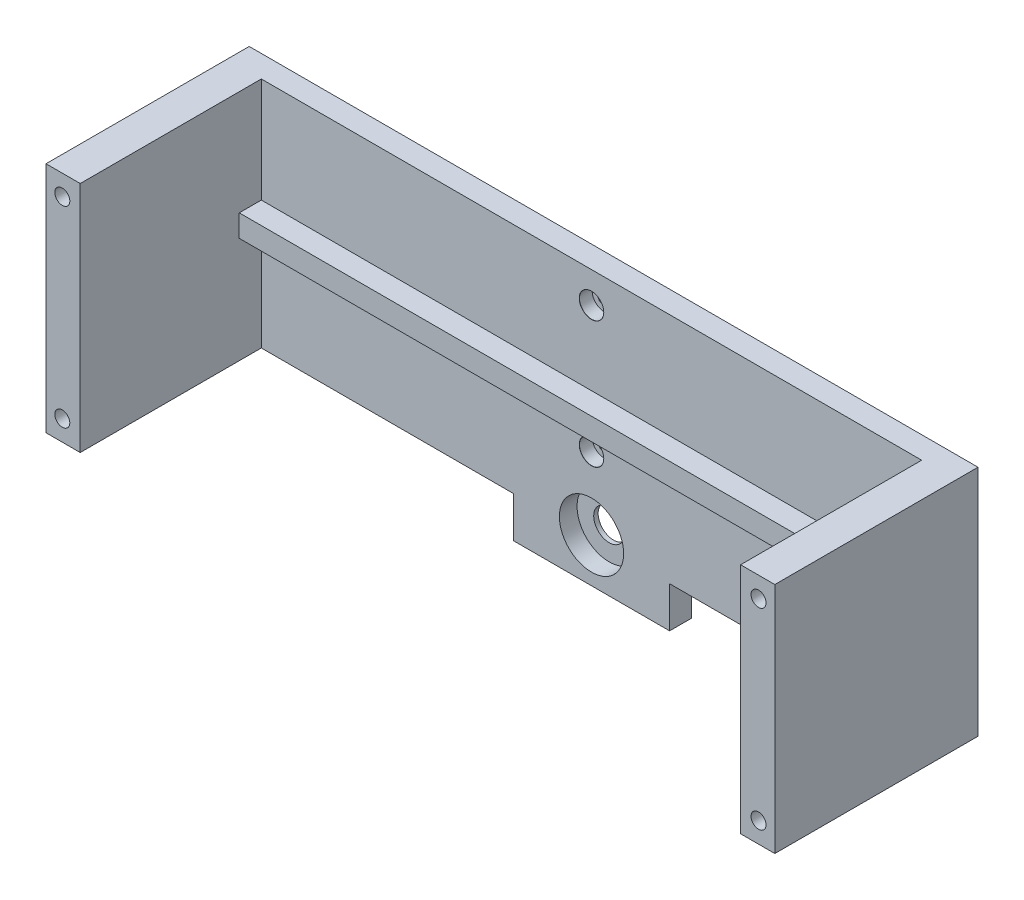
ISO-10303-21;
HEADER;
FILE_DESCRIPTION(('STEP AP214'),'2;1');
FILE_NAME('part.step','',(''),(''),'','','');
FILE_SCHEMA(('AUTOMOTIVE_DESIGN { 1 0 10303 214 1 1 1 1 }'));
ENDSEC;
DATA;
#1=APPLICATION_CONTEXT('core data for automotive mechanical design processes');
#2=APPLICATION_PROTOCOL_DEFINITION('international standard','automotive_design',2000,#1);
#3=PRODUCT_CONTEXT('',#1,'mechanical');
#4=PRODUCT('Part','Part','',(#3));
#5=PRODUCT_RELATED_PRODUCT_CATEGORY('part','',(#4));
#6=PRODUCT_DEFINITION_FORMATION('','',#4);
#7=PRODUCT_DEFINITION_CONTEXT('part definition',#1,'design');
#8=PRODUCT_DEFINITION('design','',#6,#7);
#9=PRODUCT_DEFINITION_SHAPE('','',#8);
#10=(LENGTH_UNIT() NAMED_UNIT(*) SI_UNIT(.MILLI.,.METRE.));
#11=(NAMED_UNIT(*) PLANE_ANGLE_UNIT() SI_UNIT($,.RADIAN.));
#12=(NAMED_UNIT(*) SI_UNIT($,.STERADIAN.) SOLID_ANGLE_UNIT());
#13=UNCERTAINTY_MEASURE_WITH_UNIT(LENGTH_MEASURE(1.E-05),#10,'distance_accuracy_value','');
#14=(GEOMETRIC_REPRESENTATION_CONTEXT(3) GLOBAL_UNCERTAINTY_ASSIGNED_CONTEXT((#13)) GLOBAL_UNIT_ASSIGNED_CONTEXT((#10,
#11,#12)) REPRESENTATION_CONTEXT('',''));
#15=CARTESIAN_POINT('',(0.,0.,0.));
#16=DIRECTION('',(0.,0.,1.));
#17=DIRECTION('',(1.,0.,0.));
#18=AXIS2_PLACEMENT_3D('',#15,#16,#17);
#19=CARTESIAN_POINT('',(-30.9078306890508,-31.9758108108108,5.));
#20=DIRECTION('',(0.,1.,0.));
#21=DIRECTION('',(0.,0.,1.));
#22=AXIS2_PLACEMENT_3D('',#19,#20,#21);
#23=PLANE('',#22);
#24=DIRECTION('',(0.,0.,1.));
#25=VECTOR('',#24,1.);
#26=CARTESIAN_POINT('',(69.2721693109492,-31.9758108108108,5.));
#27=LINE('',#26,#25);
#28=CARTESIAN_POINT('',(69.2721693109492,-31.9758108108108,0.));
#29=VERTEX_POINT('',#28);
#30=CARTESIAN_POINT('',(69.2721693109492,-31.9758108108108,5.));
#31=VERTEX_POINT('',#30);
#32=EDGE_CURVE('E189',#29,#31,#27,.T.);
#33=ORIENTED_EDGE('',*,*,#32,.F.);
#34=DIRECTION('',(1.,0.,0.));
#35=VECTOR('',#34,1.);
#36=CARTESIAN_POINT('',(-30.9078306890508,-31.9758108108108,0.));
#37=LINE('',#36,#35);
#38=CARTESIAN_POINT('',(134.092169310949,-31.9758108108108,0.));
#39=VERTEX_POINT('',#38);
#40=EDGE_CURVE('E325',#29,#39,#37,.T.);
#41=ORIENTED_EDGE('',*,*,#40,.T.);
#42=DIRECTION('',(0.,0.,-1.));
#43=VECTOR('',#42,1.);
#44=CARTESIAN_POINT('',(134.092169310949,-31.9758108108108,5.));
#45=LINE('',#44,#43);
#46=CARTESIAN_POINT('',(134.092169310949,-31.9758108108108,46.));
#47=VERTEX_POINT('',#46);
#48=EDGE_CURVE('E49',#47,#39,#45,.T.);
#49=ORIENTED_EDGE('',*,*,#48,.F.);
#50=DIRECTION('',(1.,0.,0.));
#51=VECTOR('',#50,1.);
#52=CARTESIAN_POINT('',(134.092169310949,-31.9758108108108,46.));
#53=LINE('',#52,#51);
#54=CARTESIAN_POINT('',(126.342169310949,-31.9758108108108,46.));
#55=VERTEX_POINT('',#54);
#56=EDGE_CURVE('E270',#55,#47,#53,.T.);
#57=ORIENTED_EDGE('',*,*,#56,.F.);
#58=DIRECTION('',(0.,0.,-1.));
#59=VECTOR('',#58,1.);
#60=CARTESIAN_POINT('',(126.342169310949,-31.9758108108108,46.));
#61=LINE('',#60,#59);
#62=CARTESIAN_POINT('',(126.342169310949,-31.9758108108108,5.));
#63=VERTEX_POINT('',#62);
#64=EDGE_CURVE('E308',#55,#63,#61,.T.);
#65=ORIENTED_EDGE('',*,*,#64,.T.);
#66=DIRECTION('',(1.,0.,0.));
#67=VECTOR('',#66,1.);
#68=CARTESIAN_POINT('',(-30.9078306890508,-31.9758108108108,5.));
#69=LINE('',#68,#67);
#70=EDGE_CURVE('E56',#31,#63,#69,.T.);
#71=ORIENTED_EDGE('',*,*,#70,.F.);
#72=EDGE_LOOP('',(#33,#41,#49,#57,#65,#71));
#73=FACE_BOUND('',#72,.T.);
#74=ADVANCED_FACE('F41',(#73),#23,.F.);
#75=DIRECTION('',(0.,0.,-1.));
#76=VECTOR('',#75,1.);
#77=CARTESIAN_POINT('',(33.9121693109492,-31.9758108108108,5.));
#78=LINE('',#77,#76);
#79=CARTESIAN_POINT('',(33.9121693109492,-31.9758108108108,5.));
#80=VERTEX_POINT('',#79);
#81=CARTESIAN_POINT('',(33.9121693109492,-31.9758108108108,0.));
#82=VERTEX_POINT('',#81);
#83=EDGE_CURVE('E64',#80,#82,#78,.T.);
#84=ORIENTED_EDGE('',*,*,#83,.F.);
#85=CARTESIAN_POINT('',(-23.1578306890508,-31.9758108108108,5.));
#86=VERTEX_POINT('',#85);
#87=EDGE_CURVE('E318',#86,#80,#69,.T.);
#88=ORIENTED_EDGE('',*,*,#87,.F.);
#89=DIRECTION('',(0.,0.,-1.));
#90=VECTOR('',#89,1.);
#91=CARTESIAN_POINT('',(-23.1578306890508,-31.9758108108108,46.));
#92=LINE('',#91,#90);
#93=CARTESIAN_POINT('',(-23.1578306890508,-31.9758108108108,46.));
#94=VERTEX_POINT('',#93);
#95=EDGE_CURVE('E314',#94,#86,#92,.T.);
#96=ORIENTED_EDGE('',*,*,#95,.F.);
#97=DIRECTION('',(1.,0.,0.));
#98=VECTOR('',#97,1.);
#99=CARTESIAN_POINT('',(-30.9078306890508,-31.9758108108108,46.));
#100=LINE('',#99,#98);
#101=CARTESIAN_POINT('',(-30.9078306890508,-31.9758108108108,46.));
#102=VERTEX_POINT('',#101);
#103=EDGE_CURVE('E263',#102,#94,#100,.T.);
#104=ORIENTED_EDGE('',*,*,#103,.F.);
#105=DIRECTION('',(0.,0.,-1.));
#106=VECTOR('',#105,1.);
#107=CARTESIAN_POINT('',(-30.9078306890508,-31.9758108108108,5.));
#108=LINE('',#107,#106);
#109=CARTESIAN_POINT('',(-30.9078306890508,-31.9758108108108,0.));
#110=VERTEX_POINT('',#109);
#111=EDGE_CURVE('E11',#102,#110,#108,.T.);
#112=ORIENTED_EDGE('',*,*,#111,.T.);
#113=EDGE_CURVE('E326',#110,#82,#37,.T.);
#114=ORIENTED_EDGE('',*,*,#113,.T.);
#115=EDGE_LOOP('',(#84,#88,#96,#104,#112,#114));
#116=FACE_BOUND('',#115,.T.);
#117=ADVANCED_FACE('F383',(#116),#23,.F.);
#118=CARTESIAN_POINT('',(-23.1578306890508,-7.97581081081081,46.));
#119=DIRECTION('',(0.,1.,0.));
#120=DIRECTION('',(0.,0.,1.));
#121=AXIS2_PLACEMENT_3D('',#118,#119,#120);
#122=PLANE('',#121);
#123=DIRECTION('',(1.,0.,0.));
#124=VECTOR('',#123,1.);
#125=CARTESIAN_POINT('',(-23.1578306890508,-7.97581081081081,9.99999999999998));
#126=LINE('',#125,#124);
#127=CARTESIAN_POINT('',(-23.1578306890508,-7.97581081081081,9.99999999999998));
#128=VERTEX_POINT('',#127);
#129=CARTESIAN_POINT('',(126.342169310949,-7.97581081081081,9.99999999999998));
#130=VERTEX_POINT('',#129);
#131=EDGE_CURVE('E251',#128,#130,#126,.T.);
#132=ORIENTED_EDGE('',*,*,#131,.F.);
#133=DIRECTION('',(0.,0.,-1.));
#134=VECTOR('',#133,1.);
#135=CARTESIAN_POINT('',(-23.1578306890508,-7.97581081081081,46.));
#136=LINE('',#135,#134);
#137=CARTESIAN_POINT('',(-23.1578306890508,-7.97581081081081,5.));
#138=VERTEX_POINT('',#137);
#139=EDGE_CURVE('E312',#128,#138,#136,.T.);
#140=ORIENTED_EDGE('',*,*,#139,.T.);
#141=DIRECTION('',(1.,0.,0.));
#142=VECTOR('',#141,1.);
#143=CARTESIAN_POINT('',(-23.1578306890508,-7.97581081081081,5.));
#144=LINE('',#143,#142);
#145=CARTESIAN_POINT('',(126.342169310949,-7.97581081081081,5.));
#146=VERTEX_POINT('',#145);
#147=EDGE_CURVE('E285',#138,#146,#144,.T.);
#148=ORIENTED_EDGE('',*,*,#147,.T.);
#149=DIRECTION('',(0.,0.,-1.));
#150=VECTOR('',#149,1.);
#151=CARTESIAN_POINT('',(126.342169310949,-7.97581081081081,46.));
#152=LINE('',#151,#150);
#153=EDGE_CURVE('E310',#130,#146,#152,.T.);
#154=ORIENTED_EDGE('',*,*,#153,.F.);
#155=EDGE_LOOP('',(#132,#140,#148,#154));
#156=FACE_BOUND('',#155,.T.);
#157=ADVANCED_FACE('F381',(#156),#122,.F.);
#158=CARTESIAN_POINT('',(-23.1578306890508,-2.97581081081081,46.));
#159=DIRECTION('',(0.,-1.,0.));
#160=DIRECTION('',(0.,0.,-1.));
#161=AXIS2_PLACEMENT_3D('',#158,#159,#160);
#162=PLANE('',#161);
#163=DIRECTION('',(-1.,0.,0.));
#164=VECTOR('',#163,1.);
#165=CARTESIAN_POINT('',(-23.1578306890508,-2.97581081081081,9.99999999999998));
#166=LINE('',#165,#164);
#167=CARTESIAN_POINT('',(126.342169310949,-2.97581081081081,9.99999999999998));
#168=VERTEX_POINT('',#167);
#169=CARTESIAN_POINT('',(-23.1578306890508,-2.97581081081081,9.99999999999998));
#170=VERTEX_POINT('',#169);
#171=EDGE_CURVE('E256',#168,#170,#166,.T.);
#172=ORIENTED_EDGE('',*,*,#171,.F.);
#173=DIRECTION('',(0.,0.,-1.));
#174=VECTOR('',#173,1.);
#175=CARTESIAN_POINT('',(126.342169310949,-2.97581081081081,46.));
#176=LINE('',#175,#174);
#177=CARTESIAN_POINT('',(126.342169310949,-2.97581081081081,5.));
#178=VERTEX_POINT('',#177);
#179=EDGE_CURVE('E303',#168,#178,#176,.T.);
#180=ORIENTED_EDGE('',*,*,#179,.T.);
#181=DIRECTION('',(-1.,0.,0.));
#182=VECTOR('',#181,1.);
#183=CARTESIAN_POINT('',(-23.1578306890508,-2.97581081081081,5.));
#184=LINE('',#183,#182);
#185=CARTESIAN_POINT('',(-23.1578306890508,-2.97581081081081,5.));
#186=VERTEX_POINT('',#185);
#187=EDGE_CURVE('E294',#178,#186,#184,.T.);
#188=ORIENTED_EDGE('',*,*,#187,.T.);
#189=DIRECTION('',(0.,0.,-1.));
#190=VECTOR('',#189,1.);
#191=CARTESIAN_POINT('',(-23.1578306890508,-2.97581081081081,46.));
#192=LINE('',#191,#190);
#193=EDGE_CURVE('E301',#170,#186,#192,.T.);
#194=ORIENTED_EDGE('',*,*,#193,.F.);
#195=EDGE_LOOP('',(#172,#180,#188,#194));
#196=FACE_BOUND('',#195,.T.);
#197=ADVANCED_FACE('F370',(#196),#162,.F.);
#198=CARTESIAN_POINT('',(0.,0.,46.));
#199=DIRECTION('',(0.,0.,1.));
#200=DIRECTION('',(1.,0.,0.));
#201=AXIS2_PLACEMENT_3D('',#198,#199,#200);
#202=PLANE('',#201);
#203=CARTESIAN_POINT('',(-27.2209329288818,16.1491891891892,46.));
#204=DIRECTION('',(0.,0.,1.));
#205=DIRECTION('',(1.,0.,0.));
#206=AXIS2_PLACEMENT_3D('',#203,#204,#205);
#207=CIRCLE('',#206,1.69999999999999);
#208=CARTESIAN_POINT('',(-25.5209329288818,16.1491891891892,46.));
#209=VERTEX_POINT('',#208);
#210=EDGE_CURVE('E225',#209,#209,#207,.T.);
#211=ORIENTED_EDGE('',*,*,#210,.F.);
#212=EDGE_LOOP('',(#211));
#213=FACE_BOUND('',#212,.T.);
#214=CARTESIAN_POINT('',(-27.2209329288818,-27.3508108108108,46.));
#215=DIRECTION('',(0.,0.,1.));
#216=DIRECTION('',(1.,0.,0.));
#217=AXIS2_PLACEMENT_3D('',#214,#215,#216);
#218=CIRCLE('',#217,1.69999999999999);
#219=CARTESIAN_POINT('',(-25.5209329288818,-27.3508108108108,46.));
#220=VERTEX_POINT('',#219);
#221=EDGE_CURVE('E243',#220,#220,#218,.T.);
#222=ORIENTED_EDGE('',*,*,#221,.F.);
#223=EDGE_LOOP('',(#222));
#224=FACE_BOUND('',#223,.T.);
#225=DIRECTION('',(0.,1.,0.));
#226=VECTOR('',#225,1.);
#227=CARTESIAN_POINT('',(-23.1578306890508,-7.97581081081081,46.));
#228=LINE('',#227,#226);
#229=CARTESIAN_POINT('',(-23.1578306890508,20.7741891891892,46.));
#230=VERTEX_POINT('',#229);
#231=EDGE_CURVE('E266',#94,#230,#228,.T.);
#232=ORIENTED_EDGE('',*,*,#231,.T.);
#233=DIRECTION('',(-1.,0.,0.));
#234=VECTOR('',#233,1.);
#235=CARTESIAN_POINT('',(-30.9078306890508,20.7741891891892,46.));
#236=LINE('',#235,#234);
#237=CARTESIAN_POINT('',(-30.9078306890508,20.7741891891892,46.));
#238=VERTEX_POINT('',#237);
#239=EDGE_CURVE('E279',#230,#238,#236,.T.);
#240=ORIENTED_EDGE('',*,*,#239,.T.);
#241=DIRECTION('',(0.,-1.,0.));
#242=VECTOR('',#241,1.);
#243=CARTESIAN_POINT('',(-30.9078306890508,20.7741891891892,46.));
#244=LINE('',#243,#242);
#245=EDGE_CURVE('E260',#238,#102,#244,.T.);
#246=ORIENTED_EDGE('',*,*,#245,.T.);
#247=ORIENTED_EDGE('',*,*,#103,.T.);
#248=EDGE_LOOP('',(#232,#240,#246,#247));
#249=FACE_BOUND('',#248,.T.);
#250=ADVANCED_FACE('F355',(#213,#224,#249),#202,.T.);
#251=CARTESIAN_POINT('',(0.,0.,5.));
#252=DIRECTION('',(0.,0.,1.));
#253=DIRECTION('',(1.,0.,0.));
#254=AXIS2_PLACEMENT_3D('',#251,#252,#253);
#255=PLANE('',#254);
#256=CARTESIAN_POINT('',(51.5921693109492,13.7741891891892,5.));
#257=DIRECTION('',(0.,0.,1.));
#258=DIRECTION('',(1.,0.,0.));
#259=AXIS2_PLACEMENT_3D('',#256,#257,#258);
#260=CIRCLE('',#259,2.775);
#261=CARTESIAN_POINT('',(54.3671693109492,13.7741891891892,5.));
#262=VERTEX_POINT('',#261);
#263=EDGE_CURVE('E190',#262,#262,#260,.T.);
#264=ORIENTED_EDGE('',*,*,#263,.F.);
#265=EDGE_LOOP('',(#264));
#266=FACE_BOUND('',#265,.T.);
#267=DIRECTION('',(0.,1.,0.));
#268=VECTOR('',#267,1.);
#269=CARTESIAN_POINT('',(-23.1578306890508,20.7741891891892,5.));
#270=LINE('',#269,#268);
#271=CARTESIAN_POINT('',(-23.1578306890508,20.7741891891892,5.));
#272=VERTEX_POINT('',#271);
#273=EDGE_CURVE('E264',#186,#272,#270,.T.);
#274=ORIENTED_EDGE('',*,*,#273,.F.);
#275=ORIENTED_EDGE('',*,*,#187,.F.);
#276=DIRECTION('',(0.,-1.,0.));
#277=VECTOR('',#276,1.);
#278=CARTESIAN_POINT('',(126.342169310949,20.7741891891892,5.));
#279=LINE('',#278,#277);
#280=CARTESIAN_POINT('',(126.342169310949,20.7741891891892,5.));
#281=VERTEX_POINT('',#280);
#282=EDGE_CURVE('E291',#281,#178,#279,.T.);
#283=ORIENTED_EDGE('',*,*,#282,.F.);
#284=DIRECTION('',(-1.,0.,0.));
#285=VECTOR('',#284,1.);
#286=CARTESIAN_POINT('',(-30.9078306890508,20.7741891891892,5.));
#287=LINE('',#286,#285);
#288=EDGE_CURVE('E320',#281,#272,#287,.T.);
#289=ORIENTED_EDGE('',*,*,#288,.T.);
#290=EDGE_LOOP('',(#274,#275,#283,#289));
#291=FACE_BOUND('',#290,.T.);
#292=ADVANCED_FACE('F367',(#266,#291),#255,.T.);
#293=CARTESIAN_POINT('',(-30.9078306890508,20.7741891891892,5.));
#294=DIRECTION('',(1.,0.,0.));
#295=DIRECTION('',(0.,1.,0.));
#296=AXIS2_PLACEMENT_3D('',#293,#294,#295);
#297=PLANE('',#296);
#298=DIRECTION('',(0.,-1.,0.));
#299=VECTOR('',#298,1.);
#300=CARTESIAN_POINT('',(-30.9078306890508,20.7741891891892,0.));
#301=LINE('',#300,#299);
#302=CARTESIAN_POINT('',(-30.9078306890508,20.7741891891892,0.));
#303=VERTEX_POINT('',#302);
#304=EDGE_CURVE('E317',#303,#110,#301,.T.);
#305=ORIENTED_EDGE('',*,*,#304,.T.);
#306=ORIENTED_EDGE('',*,*,#111,.F.);
#307=ORIENTED_EDGE('',*,*,#245,.F.);
#308=DIRECTION('',(0.,0.,-1.));
#309=VECTOR('',#308,1.);
#310=CARTESIAN_POINT('',(-30.9078306890508,20.7741891891892,5.));
#311=LINE('',#310,#309);
#312=EDGE_CURVE('E322',#238,#303,#311,.T.);
#313=ORIENTED_EDGE('',*,*,#312,.T.);
#314=EDGE_LOOP('',(#305,#306,#307,#313));
#315=FACE_BOUND('',#314,.T.);
#316=ADVANCED_FACE('F43',(#315),#297,.F.);
#317=CARTESIAN_POINT('',(134.092169310949,20.7741891891892,5.));
#318=DIRECTION('',(-1.,0.,0.));
#319=DIRECTION('',(0.,0.,1.));
#320=AXIS2_PLACEMENT_3D('',#317,#318,#319);
#321=PLANE('',#320);
#322=DIRECTION('',(0.,1.,0.));
#323=VECTOR('',#322,1.);
#324=CARTESIAN_POINT('',(134.092169310949,20.7741891891892,0.));
#325=LINE('',#324,#323);
#326=CARTESIAN_POINT('',(134.092169310949,20.7741891891892,0.));
#327=VERTEX_POINT('',#326);
#328=EDGE_CURVE('E328',#39,#327,#325,.T.);
#329=ORIENTED_EDGE('',*,*,#328,.T.);
#330=DIRECTION('',(0.,0.,-1.));
#331=VECTOR('',#330,1.);
#332=CARTESIAN_POINT('',(134.092169310949,20.7741891891892,5.));
#333=LINE('',#332,#331);
#334=CARTESIAN_POINT('',(134.092169310949,20.7741891891892,46.));
#335=VERTEX_POINT('',#334);
#336=EDGE_CURVE('E334',#335,#327,#333,.T.);
#337=ORIENTED_EDGE('',*,*,#336,.F.);
#338=DIRECTION('',(0.,1.,0.));
#339=VECTOR('',#338,1.);
#340=CARTESIAN_POINT('',(134.092169310949,20.7741891891892,46.));
#341=LINE('',#340,#339);
#342=EDGE_CURVE('E273',#47,#335,#341,.T.);
#343=ORIENTED_EDGE('',*,*,#342,.F.);
#344=ORIENTED_EDGE('',*,*,#48,.T.);
#345=EDGE_LOOP('',(#329,#337,#343,#344));
#346=FACE_BOUND('',#345,.T.);
#347=ADVANCED_FACE('F340',(#346),#321,.F.);
#348=CARTESIAN_POINT('',(-30.9078306890508,20.7741891891892,5.));
#349=DIRECTION('',(0.,-1.,0.));
#350=DIRECTION('',(0.,0.,-1.));
#351=AXIS2_PLACEMENT_3D('',#348,#349,#350);
#352=PLANE('',#351);
#353=DIRECTION('',(-1.,0.,0.));
#354=VECTOR('',#353,1.);
#355=CARTESIAN_POINT('',(-30.9078306890508,20.7741891891892,0.));
#356=LINE('',#355,#354);
#357=EDGE_CURVE('E330',#327,#303,#356,.T.);
#358=ORIENTED_EDGE('',*,*,#357,.T.);
#359=ORIENTED_EDGE('',*,*,#312,.F.);
#360=ORIENTED_EDGE('',*,*,#239,.F.);
#361=DIRECTION('',(0.,0.,-1.));
#362=VECTOR('',#361,1.);
#363=CARTESIAN_POINT('',(-23.1578306890508,20.7741891891892,46.));
#364=LINE('',#363,#362);
#365=EDGE_CURVE('E282',#230,#272,#364,.T.);
#366=ORIENTED_EDGE('',*,*,#365,.T.);
#367=ORIENTED_EDGE('',*,*,#288,.F.);
#368=DIRECTION('',(0.,0.,-1.));
#369=VECTOR('',#368,1.);
#370=CARTESIAN_POINT('',(126.342169310949,20.7741891891892,46.));
#371=LINE('',#370,#369);
#372=CARTESIAN_POINT('',(126.342169310949,20.7741891891892,46.));
#373=VERTEX_POINT('',#372);
#374=EDGE_CURVE('E305',#373,#281,#371,.T.);
#375=ORIENTED_EDGE('',*,*,#374,.F.);
#376=DIRECTION('',(-1.,0.,0.));
#377=VECTOR('',#376,1.);
#378=CARTESIAN_POINT('',(134.092169310949,20.7741891891892,46.));
#379=LINE('',#378,#377);
#380=EDGE_CURVE('E276',#335,#373,#379,.T.);
#381=ORIENTED_EDGE('',*,*,#380,.F.);
#382=ORIENTED_EDGE('',*,*,#336,.T.);
#383=EDGE_LOOP('',(#358,#359,#360,#366,#367,#375,#381,#382));
#384=FACE_BOUND('',#383,.T.);
#385=ADVANCED_FACE('F348',(#384),#352,.F.);
#386=CARTESIAN_POINT('',(51.5921693109492,-31.2758108108121,5.));
#387=DIRECTION('',(0.,0.,1.));
#388=DIRECTION('',(1.,0.,0.));
#389=AXIS2_PLACEMENT_3D('',#386,#387,#388);
#390=CIRCLE('',#389,7.2735);
#391=CARTESIAN_POINT('',(58.8656693109492,-31.2758108108121,5.));
#392=VERTEX_POINT('',#391);
#393=EDGE_CURVE('E404',#392,#392,#390,.T.);
#394=ORIENTED_EDGE('',*,*,#393,.F.);
#395=EDGE_LOOP('',(#394));
#396=FACE_BOUND('',#395,.T.);
#397=CARTESIAN_POINT('',(51.5921693109492,-14.9258108108108,5.));
#398=DIRECTION('',(0.,0.,1.));
#399=DIRECTION('',(1.,0.,0.));
#400=AXIS2_PLACEMENT_3D('',#397,#398,#399);
#401=CIRCLE('',#400,2.775);
#402=CARTESIAN_POINT('',(54.3671693109492,-14.9258108108108,5.));
#403=VERTEX_POINT('',#402);
#404=EDGE_CURVE('E210',#403,#403,#401,.T.);
#405=ORIENTED_EDGE('',*,*,#404,.F.);
#406=EDGE_LOOP('',(#405));
#407=FACE_BOUND('',#406,.T.);
#408=DIRECTION('',(0.,-1.,0.));
#409=VECTOR('',#408,1.);
#410=CARTESIAN_POINT('',(126.342169310949,-7.97581081081081,5.));
#411=LINE('',#410,#409);
#412=EDGE_CURVE('E288',#146,#63,#411,.T.);
#413=ORIENTED_EDGE('',*,*,#412,.F.);
#414=ORIENTED_EDGE('',*,*,#147,.F.);
#415=DIRECTION('',(0.,1.,0.));
#416=VECTOR('',#415,1.);
#417=CARTESIAN_POINT('',(-23.1578306890508,-7.97581081081081,5.));
#418=LINE('',#417,#416);
#419=EDGE_CURVE('E259',#86,#138,#418,.T.);
#420=ORIENTED_EDGE('',*,*,#419,.F.);
#421=ORIENTED_EDGE('',*,*,#87,.T.);
#422=DIRECTION('',(0.,1.,0.));
#423=VECTOR('',#422,1.);
#424=CARTESIAN_POINT('',(33.9121693109492,-41.2258108108108,5.));
#425=LINE('',#424,#423);
#426=CARTESIAN_POINT('',(33.9121693109492,-41.2258108108108,5.));
#427=VERTEX_POINT('',#426);
#428=EDGE_CURVE('E174',#427,#80,#425,.T.);
#429=ORIENTED_EDGE('',*,*,#428,.F.);
#430=DIRECTION('',(-1.,0.,0.));
#431=VECTOR('',#430,1.);
#432=CARTESIAN_POINT('',(69.2721693109492,-41.2258108108108,5.));
#433=LINE('',#432,#431);
#434=CARTESIAN_POINT('',(69.2721693109492,-41.2258108108108,5.));
#435=VERTEX_POINT('',#434);
#436=EDGE_CURVE('E166',#435,#427,#433,.T.);
#437=ORIENTED_EDGE('',*,*,#436,.F.);
#438=DIRECTION('',(0.,1.,0.));
#439=VECTOR('',#438,1.);
#440=CARTESIAN_POINT('',(69.2721693109492,-41.2258108108108,5.));
#441=LINE('',#440,#439);
#442=EDGE_CURVE('E171',#435,#31,#441,.T.);
#443=ORIENTED_EDGE('',*,*,#442,.T.);
#444=ORIENTED_EDGE('',*,*,#70,.T.);
#445=EDGE_LOOP('',(#413,#414,#420,#421,#429,#437,#443,#444));
#446=FACE_BOUND('',#445,.T.);
#447=ADVANCED_FACE('F169',(#396,#407,#446),#255,.T.);
#448=CARTESIAN_POINT('',(0.,0.,0.));
#449=DIRECTION('',(0.,0.,1.));
#450=DIRECTION('',(1.,0.,0.));
#451=AXIS2_PLACEMENT_3D('',#448,#449,#450);
#452=PLANE('',#451);
#453=CARTESIAN_POINT('',(51.5921693109492,-31.2758108108121,0.));
#454=DIRECTION('',(0.,0.,1.));
#455=DIRECTION('',(1.,0.,0.));
#456=AXIS2_PLACEMENT_3D('',#453,#454,#455);
#457=CIRCLE('',#456,3.5);
#458=CARTESIAN_POINT('',(55.0921693109492,-31.2758108108121,0.));
#459=VERTEX_POINT('',#458);
#460=EDGE_CURVE('E393',#459,#459,#457,.T.);
#461=ORIENTED_EDGE('',*,*,#460,.T.);
#462=EDGE_LOOP('',(#461));
#463=FACE_BOUND('',#462,.T.);
#464=CARTESIAN_POINT('',(51.5921693109492,13.7741891891892,0.));
#465=DIRECTION('',(0.,0.,1.));
#466=DIRECTION('',(1.,0.,0.));
#467=AXIS2_PLACEMENT_3D('',#464,#465,#466);
#468=CIRCLE('',#467,1.55);
#469=CARTESIAN_POINT('',(53.1421693109492,13.7741891891892,0.));
#470=VERTEX_POINT('',#469);
#471=EDGE_CURVE('E207',#470,#470,#468,.T.);
#472=ORIENTED_EDGE('',*,*,#471,.T.);
#473=EDGE_LOOP('',(#472));
#474=FACE_BOUND('',#473,.T.);
#475=CARTESIAN_POINT('',(51.5921693109492,-14.9258108108108,0.));
#476=DIRECTION('',(0.,0.,1.));
#477=DIRECTION('',(1.,0.,0.));
#478=AXIS2_PLACEMENT_3D('',#475,#476,#477);
#479=CIRCLE('',#478,1.55);
#480=CARTESIAN_POINT('',(53.1421693109492,-14.9258108108108,0.));
#481=VERTEX_POINT('',#480);
#482=EDGE_CURVE('E222',#481,#481,#479,.T.);
#483=ORIENTED_EDGE('',*,*,#482,.T.);
#484=EDGE_LOOP('',(#483));
#485=FACE_BOUND('',#484,.T.);
#486=ORIENTED_EDGE('',*,*,#304,.F.);
#487=ORIENTED_EDGE('',*,*,#357,.F.);
#488=ORIENTED_EDGE('',*,*,#328,.F.);
#489=ORIENTED_EDGE('',*,*,#40,.F.);
#490=DIRECTION('',(0.,1.,0.));
#491=VECTOR('',#490,1.);
#492=CARTESIAN_POINT('',(69.2721693109492,-41.2258108108108,0.));
#493=LINE('',#492,#491);
#494=CARTESIAN_POINT('',(69.2721693109492,-41.2258108108108,0.));
#495=VERTEX_POINT('',#494);
#496=EDGE_CURVE('E389',#495,#29,#493,.T.);
#497=ORIENTED_EDGE('',*,*,#496,.F.);
#498=DIRECTION('',(1.,0.,0.));
#499=VECTOR('',#498,1.);
#500=CARTESIAN_POINT('',(69.2721693109492,-41.2258108108108,0.));
#501=LINE('',#500,#499);
#502=CARTESIAN_POINT('',(33.9121693109492,-41.2258108108108,0.));
#503=VERTEX_POINT('',#502);
#504=EDGE_CURVE('E183',#503,#495,#501,.T.);
#505=ORIENTED_EDGE('',*,*,#504,.F.);
#506=DIRECTION('',(0.,1.,0.));
#507=VECTOR('',#506,1.);
#508=CARTESIAN_POINT('',(33.9121693109492,-41.2258108108108,0.));
#509=LINE('',#508,#507);
#510=EDGE_CURVE('E195',#503,#82,#509,.T.);
#511=ORIENTED_EDGE('',*,*,#510,.T.);
#512=ORIENTED_EDGE('',*,*,#113,.F.);
#513=EDGE_LOOP('',(#486,#487,#488,#489,#497,#505,#511,#512));
#514=FACE_BOUND('',#513,.T.);
#515=ADVANCED_FACE('F346',(#463,#474,#485,#514),#452,.F.);
#516=CARTESIAN_POINT('',(-23.1578306890508,-7.97581081081081,46.));
#517=DIRECTION('',(-1.,0.,0.));
#518=DIRECTION('',(0.,-1.,0.));
#519=AXIS2_PLACEMENT_3D('',#516,#517,#518);
#520=PLANE('',#519);
#521=ORIENTED_EDGE('',*,*,#419,.T.);
#522=ORIENTED_EDGE('',*,*,#139,.F.);
#523=DIRECTION('',(0.,-1.,0.));
#524=VECTOR('',#523,1.);
#525=CARTESIAN_POINT('',(-23.1578306890508,-2.97581081081081,9.99999999999998));
#526=LINE('',#525,#524);
#527=EDGE_CURVE('E249',#170,#128,#526,.T.);
#528=ORIENTED_EDGE('',*,*,#527,.F.);
#529=ORIENTED_EDGE('',*,*,#193,.T.);
#530=ORIENTED_EDGE('',*,*,#273,.T.);
#531=ORIENTED_EDGE('',*,*,#365,.F.);
#532=ORIENTED_EDGE('',*,*,#231,.F.);
#533=ORIENTED_EDGE('',*,*,#95,.T.);
#534=EDGE_LOOP('',(#521,#522,#528,#529,#530,#531,#532,#533));
#535=FACE_BOUND('',#534,.T.);
#536=ADVANCED_FACE('F362',(#535),#520,.F.);
#537=CARTESIAN_POINT('',(126.342169310949,-7.97581081081081,46.));
#538=DIRECTION('',(1.,0.,0.));
#539=DIRECTION('',(0.,0.,-1.));
#540=AXIS2_PLACEMENT_3D('',#537,#538,#539);
#541=PLANE('',#540);
#542=ORIENTED_EDGE('',*,*,#412,.T.);
#543=ORIENTED_EDGE('',*,*,#64,.F.);
#544=DIRECTION('',(0.,-1.,0.));
#545=VECTOR('',#544,1.);
#546=CARTESIAN_POINT('',(126.342169310949,-7.97581081081081,46.));
#547=LINE('',#546,#545);
#548=EDGE_CURVE('E268',#373,#55,#547,.T.);
#549=ORIENTED_EDGE('',*,*,#548,.F.);
#550=ORIENTED_EDGE('',*,*,#374,.T.);
#551=ORIENTED_EDGE('',*,*,#282,.T.);
#552=ORIENTED_EDGE('',*,*,#179,.F.);
#553=DIRECTION('',(0.,1.,0.));
#554=VECTOR('',#553,1.);
#555=CARTESIAN_POINT('',(126.342169310949,-2.97581081081081,9.99999999999998));
#556=LINE('',#555,#554);
#557=EDGE_CURVE('E254',#130,#168,#556,.T.);
#558=ORIENTED_EDGE('',*,*,#557,.F.);
#559=ORIENTED_EDGE('',*,*,#153,.T.);
#560=EDGE_LOOP('',(#542,#543,#549,#550,#551,#552,#558,#559));
#561=FACE_BOUND('',#560,.T.);
#562=ADVANCED_FACE('F373',(#561),#541,.F.);
#563=CARTESIAN_POINT('',(130.40527155078,16.1491891891892,46.));
#564=DIRECTION('',(0.,0.,1.));
#565=DIRECTION('',(1.,0.,0.));
#566=AXIS2_PLACEMENT_3D('',#563,#564,#565);
#567=CIRCLE('',#566,1.69999999999998);
#568=CARTESIAN_POINT('',(132.10527155078,16.1491891891892,46.));
#569=VERTEX_POINT('',#568);
#570=EDGE_CURVE('E231',#569,#569,#567,.T.);
#571=ORIENTED_EDGE('',*,*,#570,.F.);
#572=EDGE_LOOP('',(#571));
#573=FACE_BOUND('',#572,.T.);
#574=CARTESIAN_POINT('',(130.40527155078,-27.3508108108108,46.));
#575=DIRECTION('',(0.,0.,1.));
#576=DIRECTION('',(1.,0.,0.));
#577=AXIS2_PLACEMENT_3D('',#574,#575,#576);
#578=CIRCLE('',#577,1.69999999999998);
#579=CARTESIAN_POINT('',(132.10527155078,-27.3508108108108,46.));
#580=VERTEX_POINT('',#579);
#581=EDGE_CURVE('E237',#580,#580,#578,.T.);
#582=ORIENTED_EDGE('',*,*,#581,.F.);
#583=EDGE_LOOP('',(#582));
#584=FACE_BOUND('',#583,.T.);
#585=ORIENTED_EDGE('',*,*,#380,.T.);
#586=ORIENTED_EDGE('',*,*,#548,.T.);
#587=ORIENTED_EDGE('',*,*,#56,.T.);
#588=ORIENTED_EDGE('',*,*,#342,.T.);
#589=EDGE_LOOP('',(#585,#586,#587,#588));
#590=FACE_BOUND('',#589,.T.);
#591=ADVANCED_FACE('F376',(#573,#584,#590),#202,.T.);
#592=CARTESIAN_POINT('',(0.,0.,9.99999999999998));
#593=DIRECTION('',(0.,0.,1.));
#594=DIRECTION('',(1.,0.,0.));
#595=AXIS2_PLACEMENT_3D('',#592,#593,#594);
#596=PLANE('',#595);
#597=ORIENTED_EDGE('',*,*,#527,.T.);
#598=ORIENTED_EDGE('',*,*,#131,.T.);
#599=ORIENTED_EDGE('',*,*,#557,.T.);
#600=ORIENTED_EDGE('',*,*,#171,.T.);
#601=EDGE_LOOP('',(#597,#598,#599,#600));
#602=FACE_BOUND('',#601,.T.);
#603=ADVANCED_FACE('F455',(#602),#596,.T.);
#604=CARTESIAN_POINT('',(-27.2209329288818,-27.3508108108108,40.));
#605=DIRECTION('',(0.,0.,1.));
#606=DIRECTION('',(1.,0.,0.));
#607=AXIS2_PLACEMENT_3D('',#604,#605,#606);
#608=CONICAL_SURFACE('',#607,1.7,1.02974425867665);
#609=CARTESIAN_POINT('',(-27.2209329288818,-27.3508108108108,38.9785369476531));
#610=VERTEX_POINT('',#609);
#611=VERTEX_LOOP('',#610);
#612=FACE_BOUND('',#611,.T.);
#613=CARTESIAN_POINT('',(-27.2209329288818,-27.3508108108108,40.));
#614=DIRECTION('',(0.,0.,1.));
#615=DIRECTION('',(1.,0.,0.));
#616=AXIS2_PLACEMENT_3D('',#613,#614,#615);
#617=CIRCLE('',#616,1.7);
#618=CARTESIAN_POINT('',(-25.5209329288818,-27.3508108108108,40.));
#619=VERTEX_POINT('',#618);
#620=EDGE_CURVE('E246',#619,#619,#617,.T.);
#621=ORIENTED_EDGE('',*,*,#620,.T.);
#622=EDGE_LOOP('',(#621));
#623=FACE_BOUND('',#622,.T.);
#624=ADVANCED_FACE('F459',(#612,#623),#608,.F.);
#625=CARTESIAN_POINT('',(-27.2209329288818,-27.3508108108108,46.));
#626=DIRECTION('',(0.,0.,1.));
#627=DIRECTION('',(1.,0.,0.));
#628=AXIS2_PLACEMENT_3D('',#625,#626,#627);
#629=CYLINDRICAL_SURFACE('',#628,1.69999999999999);
#630=ORIENTED_EDGE('',*,*,#620,.F.);
#631=EDGE_LOOP('',(#630));
#632=FACE_BOUND('',#631,.T.);
#633=ORIENTED_EDGE('',*,*,#221,.T.);
#634=EDGE_LOOP('',(#633));
#635=FACE_BOUND('',#634,.T.);
#636=ADVANCED_FACE('F463',(#632,#635),#629,.F.);
#637=CARTESIAN_POINT('',(130.40527155078,-27.3508108108108,40.));
#638=DIRECTION('',(0.,0.,1.));
#639=DIRECTION('',(1.,0.,0.));
#640=AXIS2_PLACEMENT_3D('',#637,#638,#639);
#641=CONICAL_SURFACE('',#640,1.70000000000001,1.02974425867665);
#642=CARTESIAN_POINT('',(130.40527155078,-27.3508108108108,38.9785369476531));
#643=VERTEX_POINT('',#642);
#644=VERTEX_LOOP('',#643);
#645=FACE_BOUND('',#644,.T.);
#646=CARTESIAN_POINT('',(130.40527155078,-27.3508108108108,40.));
#647=DIRECTION('',(0.,0.,1.));
#648=DIRECTION('',(1.,0.,0.));
#649=AXIS2_PLACEMENT_3D('',#646,#647,#648);
#650=CIRCLE('',#649,1.70000000000001);
#651=CARTESIAN_POINT('',(132.10527155078,-27.3508108108108,40.));
#652=VERTEX_POINT('',#651);
#653=EDGE_CURVE('E240',#652,#652,#650,.T.);
#654=ORIENTED_EDGE('',*,*,#653,.T.);
#655=EDGE_LOOP('',(#654));
#656=FACE_BOUND('',#655,.T.);
#657=ADVANCED_FACE('F467',(#645,#656),#641,.F.);
#658=CARTESIAN_POINT('',(130.40527155078,-27.3508108108108,46.));
#659=DIRECTION('',(0.,0.,1.));
#660=DIRECTION('',(1.,0.,0.));
#661=AXIS2_PLACEMENT_3D('',#658,#659,#660);
#662=CYLINDRICAL_SURFACE('',#661,1.69999999999999);
#663=ORIENTED_EDGE('',*,*,#653,.F.);
#664=EDGE_LOOP('',(#663));
#665=FACE_BOUND('',#664,.T.);
#666=ORIENTED_EDGE('',*,*,#581,.T.);
#667=EDGE_LOOP('',(#666));
#668=FACE_BOUND('',#667,.T.);
#669=ADVANCED_FACE('F471',(#665,#668),#662,.F.);
#670=CARTESIAN_POINT('',(130.40527155078,16.1491891891892,40.));
#671=DIRECTION('',(0.,0.,1.));
#672=DIRECTION('',(1.,0.,0.));
#673=AXIS2_PLACEMENT_3D('',#670,#671,#672);
#674=CONICAL_SURFACE('',#673,1.70000000000001,1.02974425867665);
#675=CARTESIAN_POINT('',(130.40527155078,16.1491891891892,38.9785369476531));
#676=VERTEX_POINT('',#675);
#677=VERTEX_LOOP('',#676);
#678=FACE_BOUND('',#677,.T.);
#679=CARTESIAN_POINT('',(130.40527155078,16.1491891891892,40.));
#680=DIRECTION('',(0.,0.,1.));
#681=DIRECTION('',(1.,0.,0.));
#682=AXIS2_PLACEMENT_3D('',#679,#680,#681);
#683=CIRCLE('',#682,1.70000000000001);
#684=CARTESIAN_POINT('',(132.10527155078,16.1491891891892,40.));
#685=VERTEX_POINT('',#684);
#686=EDGE_CURVE('E234',#685,#685,#683,.T.);
#687=ORIENTED_EDGE('',*,*,#686,.T.);
#688=EDGE_LOOP('',(#687));
#689=FACE_BOUND('',#688,.T.);
#690=ADVANCED_FACE('F475',(#678,#689),#674,.F.);
#691=CARTESIAN_POINT('',(130.40527155078,16.1491891891892,46.));
#692=DIRECTION('',(0.,0.,1.));
#693=DIRECTION('',(1.,0.,0.));
#694=AXIS2_PLACEMENT_3D('',#691,#692,#693);
#695=CYLINDRICAL_SURFACE('',#694,1.69999999999999);
#696=ORIENTED_EDGE('',*,*,#686,.F.);
#697=EDGE_LOOP('',(#696));
#698=FACE_BOUND('',#697,.T.);
#699=ORIENTED_EDGE('',*,*,#570,.T.);
#700=EDGE_LOOP('',(#699));
#701=FACE_BOUND('',#700,.T.);
#702=ADVANCED_FACE('F479',(#698,#701),#695,.F.);
#703=CARTESIAN_POINT('',(-27.2209329288818,16.1491891891892,40.));
#704=DIRECTION('',(0.,0.,1.));
#705=DIRECTION('',(1.,0.,0.));
#706=AXIS2_PLACEMENT_3D('',#703,#704,#705);
#707=CONICAL_SURFACE('',#706,1.7,1.02974425867665);
#708=CARTESIAN_POINT('',(-27.2209329288818,16.1491891891892,38.9785369476531));
#709=VERTEX_POINT('',#708);
#710=VERTEX_LOOP('',#709);
#711=FACE_BOUND('',#710,.T.);
#712=CARTESIAN_POINT('',(-27.2209329288818,16.1491891891892,40.));
#713=DIRECTION('',(0.,0.,1.));
#714=DIRECTION('',(1.,0.,0.));
#715=AXIS2_PLACEMENT_3D('',#712,#713,#714);
#716=CIRCLE('',#715,1.7);
#717=CARTESIAN_POINT('',(-25.5209329288818,16.1491891891892,40.));
#718=VERTEX_POINT('',#717);
#719=EDGE_CURVE('E228',#718,#718,#716,.T.);
#720=ORIENTED_EDGE('',*,*,#719,.T.);
#721=EDGE_LOOP('',(#720));
#722=FACE_BOUND('',#721,.T.);
#723=ADVANCED_FACE('F483',(#711,#722),#707,.F.);
#724=CARTESIAN_POINT('',(-27.2209329288818,16.1491891891892,46.));
#725=DIRECTION('',(0.,0.,1.));
#726=DIRECTION('',(1.,0.,0.));
#727=AXIS2_PLACEMENT_3D('',#724,#725,#726);
#728=CYLINDRICAL_SURFACE('',#727,1.69999999999999);
#729=ORIENTED_EDGE('',*,*,#719,.F.);
#730=EDGE_LOOP('',(#729));
#731=FACE_BOUND('',#730,.T.);
#732=ORIENTED_EDGE('',*,*,#210,.T.);
#733=EDGE_LOOP('',(#732));
#734=FACE_BOUND('',#733,.T.);
#735=ADVANCED_FACE('F487',(#731,#734),#728,.F.);
#736=CARTESIAN_POINT('',(51.5921693109492,-14.9258108108108,5.));
#737=DIRECTION('',(0.,0.,1.));
#738=DIRECTION('',(1.,0.,0.));
#739=AXIS2_PLACEMENT_3D('',#736,#737,#738);
#740=CYLINDRICAL_SURFACE('',#739,1.55);
#741=ORIENTED_EDGE('',*,*,#482,.F.);
#742=EDGE_LOOP('',(#741));
#743=FACE_BOUND('',#742,.T.);
#744=CARTESIAN_POINT('',(51.5921693109492,-14.9258108108108,2.1));
#745=DIRECTION('',(0.,0.,1.));
#746=DIRECTION('',(1.,0.,0.));
#747=AXIS2_PLACEMENT_3D('',#744,#745,#746);
#748=CIRCLE('',#747,1.55);
#749=CARTESIAN_POINT('',(53.1421693109492,-14.9258108108108,2.1));
#750=VERTEX_POINT('',#749);
#751=EDGE_CURVE('E219',#750,#750,#748,.T.);
#752=ORIENTED_EDGE('',*,*,#751,.T.);
#753=EDGE_LOOP('',(#752));
#754=FACE_BOUND('',#753,.T.);
#755=ADVANCED_FACE('F491',(#743,#754),#740,.F.);
#756=CARTESIAN_POINT('',(54.3421693109492,-14.9258108108108,2.1));
#757=DIRECTION('',(0.,0.,-1.));
#758=DIRECTION('',(-1.,0.,0.));
#759=AXIS2_PLACEMENT_3D('',#756,#757,#758);
#760=PLANE('',#759);
#761=ORIENTED_EDGE('',*,*,#751,.F.);
#762=EDGE_LOOP('',(#761));
#763=FACE_BOUND('',#762,.T.);
#764=CARTESIAN_POINT('',(51.5921693109492,-14.9258108108108,2.1));
#765=DIRECTION('',(0.,0.,1.));
#766=DIRECTION('',(1.,0.,0.));
#767=AXIS2_PLACEMENT_3D('',#764,#765,#766);
#768=CIRCLE('',#767,2.75);
#769=CARTESIAN_POINT('',(54.3421693109492,-14.9258108108108,2.1));
#770=VERTEX_POINT('',#769);
#771=EDGE_CURVE('E216',#770,#770,#768,.T.);
#772=ORIENTED_EDGE('',*,*,#771,.T.);
#773=EDGE_LOOP('',(#772));
#774=FACE_BOUND('',#773,.T.);
#775=ADVANCED_FACE('F428',(#763,#774),#760,.F.);
#776=CARTESIAN_POINT('',(51.5921693109492,-14.9258108108108,5.));
#777=DIRECTION('',(0.,0.,1.));
#778=DIRECTION('',(1.,0.,0.));
#779=AXIS2_PLACEMENT_3D('',#776,#777,#778);
#780=CYLINDRICAL_SURFACE('',#779,2.75);
#781=ORIENTED_EDGE('',*,*,#771,.F.);
#782=EDGE_LOOP('',(#781));
#783=FACE_BOUND('',#782,.T.);
#784=CARTESIAN_POINT('',(51.5921693109492,-14.9258108108108,4.975));
#785=DIRECTION('',(0.,0.,1.));
#786=DIRECTION('',(1.,0.,0.));
#787=AXIS2_PLACEMENT_3D('',#784,#785,#786);
#788=CIRCLE('',#787,2.75);
#789=CARTESIAN_POINT('',(54.3421693109492,-14.9258108108108,4.975));
#790=VERTEX_POINT('',#789);
#791=EDGE_CURVE('E213',#790,#790,#788,.T.);
#792=ORIENTED_EDGE('',*,*,#791,.T.);
#793=EDGE_LOOP('',(#792));
#794=FACE_BOUND('',#793,.T.);
#795=ADVANCED_FACE('F418',(#783,#794),#780,.F.);
#796=CARTESIAN_POINT('',(51.5921693109492,-14.9258108108108,5.));
#797=DIRECTION('',(0.,0.,1.));
#798=DIRECTION('',(1.,0.,0.));
#799=AXIS2_PLACEMENT_3D('',#796,#797,#798);
#800=CONICAL_SURFACE('',#799,2.775,0.785398163397379);
#801=ORIENTED_EDGE('',*,*,#791,.F.);
#802=EDGE_LOOP('',(#801));
#803=FACE_BOUND('',#802,.T.);
#804=ORIENTED_EDGE('',*,*,#404,.T.);
#805=EDGE_LOOP('',(#804));
#806=FACE_BOUND('',#805,.T.);
#807=ADVANCED_FACE('F415',(#803,#806),#800,.F.);
#808=CARTESIAN_POINT('',(51.5921693109492,13.7741891891892,5.));
#809=DIRECTION('',(0.,0.,1.));
#810=DIRECTION('',(1.,0.,0.));
#811=AXIS2_PLACEMENT_3D('',#808,#809,#810);
#812=CYLINDRICAL_SURFACE('',#811,1.55);
#813=ORIENTED_EDGE('',*,*,#471,.F.);
#814=EDGE_LOOP('',(#813));
#815=FACE_BOUND('',#814,.T.);
#816=CARTESIAN_POINT('',(51.5921693109492,13.7741891891892,2.1));
#817=DIRECTION('',(0.,0.,1.));
#818=DIRECTION('',(1.,0.,0.));
#819=AXIS2_PLACEMENT_3D('',#816,#817,#818);
#820=CIRCLE('',#819,1.55);
#821=CARTESIAN_POINT('',(53.1421693109492,13.7741891891892,2.1));
#822=VERTEX_POINT('',#821);
#823=EDGE_CURVE('E204',#822,#822,#820,.T.);
#824=ORIENTED_EDGE('',*,*,#823,.T.);
#825=EDGE_LOOP('',(#824));
#826=FACE_BOUND('',#825,.T.);
#827=ADVANCED_FACE('F417',(#815,#826),#812,.F.);
#828=CARTESIAN_POINT('',(54.3421693109492,13.7741891891892,2.1));
#829=DIRECTION('',(0.,0.,-1.));
#830=DIRECTION('',(-1.,0.,0.));
#831=AXIS2_PLACEMENT_3D('',#828,#829,#830);
#832=PLANE('',#831);
#833=ORIENTED_EDGE('',*,*,#823,.F.);
#834=EDGE_LOOP('',(#833));
#835=FACE_BOUND('',#834,.T.);
#836=CARTESIAN_POINT('',(51.5921693109492,13.7741891891892,2.1));
#837=DIRECTION('',(0.,0.,1.));
#838=DIRECTION('',(1.,0.,0.));
#839=AXIS2_PLACEMENT_3D('',#836,#837,#838);
#840=CIRCLE('',#839,2.75);
#841=CARTESIAN_POINT('',(54.3421693109492,13.7741891891892,2.1));
#842=VERTEX_POINT('',#841);
#843=EDGE_CURVE('E201',#842,#842,#840,.T.);
#844=ORIENTED_EDGE('',*,*,#843,.T.);
#845=EDGE_LOOP('',(#844));
#846=FACE_BOUND('',#845,.T.);
#847=ADVANCED_FACE('F425',(#835,#846),#832,.F.);
#848=CARTESIAN_POINT('',(51.5921693109492,13.7741891891892,5.));
#849=DIRECTION('',(0.,0.,1.));
#850=DIRECTION('',(1.,0.,0.));
#851=AXIS2_PLACEMENT_3D('',#848,#849,#850);
#852=CYLINDRICAL_SURFACE('',#851,2.75);
#853=ORIENTED_EDGE('',*,*,#843,.F.);
#854=EDGE_LOOP('',(#853));
#855=FACE_BOUND('',#854,.T.);
#856=CARTESIAN_POINT('',(51.5921693109492,13.7741891891892,4.975));
#857=DIRECTION('',(0.,0.,1.));
#858=DIRECTION('',(1.,0.,0.));
#859=AXIS2_PLACEMENT_3D('',#856,#857,#858);
#860=CIRCLE('',#859,2.75);
#861=CARTESIAN_POINT('',(54.3421693109492,13.7741891891892,4.975));
#862=VERTEX_POINT('',#861);
#863=EDGE_CURVE('E193',#862,#862,#860,.T.);
#864=ORIENTED_EDGE('',*,*,#863,.T.);
#865=EDGE_LOOP('',(#864));
#866=FACE_BOUND('',#865,.T.);
#867=ADVANCED_FACE('F533',(#855,#866),#852,.F.);
#868=CARTESIAN_POINT('',(51.5921693109492,13.7741891891892,5.));
#869=DIRECTION('',(0.,0.,1.));
#870=DIRECTION('',(1.,0.,0.));
#871=AXIS2_PLACEMENT_3D('',#868,#869,#870);
#872=CONICAL_SURFACE('',#871,2.775,0.785398163397379);
#873=ORIENTED_EDGE('',*,*,#863,.F.);
#874=EDGE_LOOP('',(#873));
#875=FACE_BOUND('',#874,.T.);
#876=ORIENTED_EDGE('',*,*,#263,.T.);
#877=EDGE_LOOP('',(#876));
#878=FACE_BOUND('',#877,.T.);
#879=ADVANCED_FACE('F543',(#875,#878),#872,.F.);
#880=CARTESIAN_POINT('',(69.2721693109492,-41.2258108108108,5.));
#881=DIRECTION('',(-1.,0.,0.));
#882=DIRECTION('',(0.,0.,1.));
#883=AXIS2_PLACEMENT_3D('',#880,#881,#882);
#884=PLANE('',#883);
#885=ORIENTED_EDGE('',*,*,#32,.T.);
#886=ORIENTED_EDGE('',*,*,#442,.F.);
#887=DIRECTION('',(0.,0.,1.));
#888=VECTOR('',#887,1.);
#889=CARTESIAN_POINT('',(69.2721693109492,-41.2258108108108,5.));
#890=LINE('',#889,#888);
#891=EDGE_CURVE('E178',#495,#435,#890,.T.);
#892=ORIENTED_EDGE('',*,*,#891,.F.);
#893=ORIENTED_EDGE('',*,*,#496,.T.);
#894=EDGE_LOOP('',(#885,#886,#892,#893));
#895=FACE_BOUND('',#894,.T.);
#896=ADVANCED_FACE('F188',(#895),#884,.F.);
#897=CARTESIAN_POINT('',(33.9121693109492,-41.2258108108108,5.));
#898=DIRECTION('',(1.,0.,0.));
#899=DIRECTION('',(0.,0.,-1.));
#900=AXIS2_PLACEMENT_3D('',#897,#898,#899);
#901=PLANE('',#900);
#902=ORIENTED_EDGE('',*,*,#83,.T.);
#903=ORIENTED_EDGE('',*,*,#510,.F.);
#904=DIRECTION('',(0.,0.,-1.));
#905=VECTOR('',#904,1.);
#906=CARTESIAN_POINT('',(33.9121693109492,-41.2258108108108,5.));
#907=LINE('',#906,#905);
#908=EDGE_CURVE('E177',#427,#503,#907,.T.);
#909=ORIENTED_EDGE('',*,*,#908,.F.);
#910=ORIENTED_EDGE('',*,*,#428,.T.);
#911=EDGE_LOOP('',(#902,#903,#909,#910));
#912=FACE_BOUND('',#911,.T.);
#913=ADVANCED_FACE('F387',(#912),#901,.F.);
#914=CARTESIAN_POINT('',(0.,-41.2258108108108,0.));
#915=DIRECTION('',(0.,1.,0.));
#916=DIRECTION('',(0.,0.,1.));
#917=AXIS2_PLACEMENT_3D('',#914,#915,#916);
#918=PLANE('',#917);
#919=ORIENTED_EDGE('',*,*,#891,.T.);
#920=ORIENTED_EDGE('',*,*,#436,.T.);
#921=ORIENTED_EDGE('',*,*,#908,.T.);
#922=ORIENTED_EDGE('',*,*,#504,.T.);
#923=EDGE_LOOP('',(#919,#920,#921,#922));
#924=FACE_BOUND('',#923,.T.);
#925=ADVANCED_FACE('F181',(#924),#918,.F.);
#926=CARTESIAN_POINT('',(51.5921693109492,-31.2758108108121,5.));
#927=DIRECTION('',(0.,0.,1.));
#928=DIRECTION('',(1.,0.,0.));
#929=AXIS2_PLACEMENT_3D('',#926,#927,#928);
#930=CYLINDRICAL_SURFACE('',#929,3.5);
#931=ORIENTED_EDGE('',*,*,#460,.F.);
#932=EDGE_LOOP('',(#931));
#933=FACE_BOUND('',#932,.T.);
#934=CARTESIAN_POINT('',(51.5921693109492,-31.2758108108121,1.));
#935=DIRECTION('',(0.,0.,1.));
#936=DIRECTION('',(1.,0.,0.));
#937=AXIS2_PLACEMENT_3D('',#934,#935,#936);
#938=CIRCLE('',#937,3.5);
#939=CARTESIAN_POINT('',(55.0921693109492,-31.2758108108121,1.));
#940=VERTEX_POINT('',#939);
#941=EDGE_CURVE('E398',#940,#940,#938,.T.);
#942=ORIENTED_EDGE('',*,*,#941,.T.);
#943=EDGE_LOOP('',(#942));
#944=FACE_BOUND('',#943,.T.);
#945=ADVANCED_FACE('F617',(#933,#944),#930,.F.);
#946=CARTESIAN_POINT('',(55.0921693109492,-31.2758108108121,1.));
#947=DIRECTION('',(0.,0.,-1.));
#948=DIRECTION('',(-1.,0.,0.));
#949=AXIS2_PLACEMENT_3D('',#946,#947,#948);
#950=PLANE('',#949);
#951=ORIENTED_EDGE('',*,*,#941,.F.);
#952=EDGE_LOOP('',(#951));
#953=FACE_BOUND('',#952,.T.);
#954=CARTESIAN_POINT('',(51.5921693109492,-31.2758108108121,1.));
#955=DIRECTION('',(0.,0.,1.));
#956=DIRECTION('',(1.,0.,0.));
#957=AXIS2_PLACEMENT_3D('',#954,#955,#956);
#958=CIRCLE('',#957,7.2735);
#959=CARTESIAN_POINT('',(58.8656693109492,-31.2758108108121,1.));
#960=VERTEX_POINT('',#959);
#961=EDGE_CURVE('E401',#960,#960,#958,.T.);
#962=ORIENTED_EDGE('',*,*,#961,.T.);
#963=EDGE_LOOP('',(#962));
#964=FACE_BOUND('',#963,.T.);
#965=ADVANCED_FACE('F625',(#953,#964),#950,.F.);
#966=CARTESIAN_POINT('',(51.5921693109492,-31.2758108108121,5.));
#967=DIRECTION('',(0.,0.,1.));
#968=DIRECTION('',(1.,0.,0.));
#969=AXIS2_PLACEMENT_3D('',#966,#967,#968);
#970=CYLINDRICAL_SURFACE('',#969,7.2735);
#971=ORIENTED_EDGE('',*,*,#961,.F.);
#972=EDGE_LOOP('',(#971));
#973=FACE_BOUND('',#972,.T.);
#974=ORIENTED_EDGE('',*,*,#393,.T.);
#975=EDGE_LOOP('',(#974));
#976=FACE_BOUND('',#975,.T.);
#977=ADVANCED_FACE('F408',(#973,#976),#970,.F.);
#978=CLOSED_SHELL('',(#74,#117,#157,#197,#250,#292,#316,#347,#385,#447,#515,#536,#562,#591,#603,
#624,#636,#657,#669,#690,#702,#723,#735,#755,#775,#795,#807,#827,#847,#867,#879,#896,#913,#925,
#945,#965,#977));
#979=MANIFOLD_SOLID_BREP('B2',#978);
#980=ADVANCED_BREP_SHAPE_REPRESENTATION('',(#18,#979),#14);
#981=SHAPE_DEFINITION_REPRESENTATION(#9,#980);
ENDSEC;
END-ISO-10303-21;
